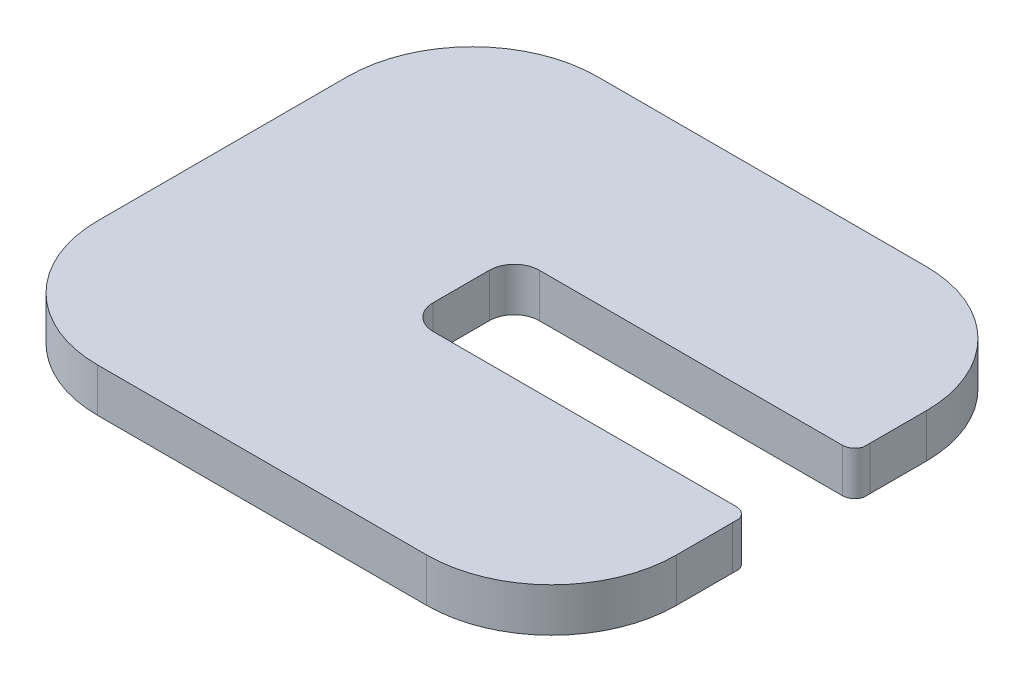
ISO-10303-21;
HEADER;
FILE_DESCRIPTION(('STEP AP214'),'2;1');
FILE_NAME('part.step','',(''),(''),'','','');
FILE_SCHEMA(('AUTOMOTIVE_DESIGN { 1 0 10303 214 1 1 1 1 }'));
ENDSEC;
DATA;
#1=APPLICATION_CONTEXT('core data for automotive mechanical design processes');
#2=APPLICATION_PROTOCOL_DEFINITION('international standard','automotive_design',2000,#1);
#3=PRODUCT_CONTEXT('',#1,'mechanical');
#4=PRODUCT('Part','Part','',(#3));
#5=PRODUCT_RELATED_PRODUCT_CATEGORY('part','',(#4));
#6=PRODUCT_DEFINITION_FORMATION('','',#4);
#7=PRODUCT_DEFINITION_CONTEXT('part definition',#1,'design');
#8=PRODUCT_DEFINITION('design','',#6,#7);
#9=PRODUCT_DEFINITION_SHAPE('','',#8);
#10=(LENGTH_UNIT() NAMED_UNIT(*) SI_UNIT(.MILLI.,.METRE.));
#11=(NAMED_UNIT(*) PLANE_ANGLE_UNIT() SI_UNIT($,.RADIAN.));
#12=(NAMED_UNIT(*) SI_UNIT($,.STERADIAN.) SOLID_ANGLE_UNIT());
#13=UNCERTAINTY_MEASURE_WITH_UNIT(LENGTH_MEASURE(1.E-05),#10,'distance_accuracy_value','');
#14=(GEOMETRIC_REPRESENTATION_CONTEXT(3) GLOBAL_UNCERTAINTY_ASSIGNED_CONTEXT((#13)) GLOBAL_UNIT_ASSIGNED_CONTEXT((#10,
#11,#12)) REPRESENTATION_CONTEXT('',''));
#15=CARTESIAN_POINT('',(0.,0.,0.));
#16=DIRECTION('',(0.,0.,1.));
#17=DIRECTION('',(1.,0.,0.));
#18=AXIS2_PLACEMENT_3D('',#15,#16,#17);
#19=CARTESIAN_POINT('',(-1.41064064605512,0.35,0.));
#20=DIRECTION('',(0.,1.,0.));
#21=DIRECTION('',(0.,0.,1.));
#22=AXIS2_PLACEMENT_3D('',#19,#20,#21);
#23=PLANE('',#22);
#24=CARTESIAN_POINT('',(-0.910640646055121,0.35,-1.));
#25=DIRECTION('',(0.,1.,0.));
#26=DIRECTION('',(0.,0.,1.));
#27=AXIS2_PLACEMENT_3D('',#24,#25,#26);
#28=CIRCLE('',#27,1.);
#29=CARTESIAN_POINT('',(-0.910640646055121,0.35,-2.));
#30=VERTEX_POINT('',#29);
#31=CARTESIAN_POINT('',(-1.91064064605512,0.35,-1.));
#32=VERTEX_POINT('',#31);
#33=EDGE_CURVE('E198',#30,#32,#28,.T.);
#34=ORIENTED_EDGE('',*,*,#33,.T.);
#35=DIRECTION('',(0.,0.,1.));
#36=VECTOR('',#35,1.);
#37=CARTESIAN_POINT('',(-1.91064064605512,0.35,-1.));
#38=LINE('',#37,#36);
#39=CARTESIAN_POINT('',(-1.91064064605512,0.35,1.));
#40=VERTEX_POINT('',#39);
#41=EDGE_CURVE('E206',#32,#40,#38,.T.);
#42=ORIENTED_EDGE('',*,*,#41,.T.);
#43=CARTESIAN_POINT('',(-0.910640646055121,0.35,1.));
#44=DIRECTION('',(0.,1.,0.));
#45=DIRECTION('',(0.,0.,-1.));
#46=AXIS2_PLACEMENT_3D('',#43,#44,#45);
#47=CIRCLE('',#46,1.);
#48=CARTESIAN_POINT('',(-0.910640646055121,0.35,2.));
#49=VERTEX_POINT('',#48);
#50=EDGE_CURVE('E209',#40,#49,#47,.T.);
#51=ORIENTED_EDGE('',*,*,#50,.T.);
#52=DIRECTION('',(1.,0.,0.));
#53=VECTOR('',#52,1.);
#54=CARTESIAN_POINT('',(1.72338750187201,0.35,2.));
#55=LINE('',#54,#53);
#56=CARTESIAN_POINT('',(1.72338750187201,0.35,2.));
#57=VERTEX_POINT('',#56);
#58=EDGE_CURVE('E213',#49,#57,#55,.T.);
#59=ORIENTED_EDGE('',*,*,#58,.T.);
#60=CARTESIAN_POINT('',(1.72338750187201,0.35,1.));
#61=DIRECTION('',(0.,1.,0.));
#62=DIRECTION('',(0.,0.,1.));
#63=AXIS2_PLACEMENT_3D('',#60,#61,#62);
#64=CIRCLE('',#63,1.);
#65=CARTESIAN_POINT('',(2.72338750187201,0.35,1.));
#66=VERTEX_POINT('',#65);
#67=EDGE_CURVE('E217',#57,#66,#64,.T.);
#68=ORIENTED_EDGE('',*,*,#67,.T.);
#69=DIRECTION('',(0.,0.,-1.));
#70=VECTOR('',#69,1.);
#71=CARTESIAN_POINT('',(2.72338750187201,0.35,0.499118095489748));
#72=LINE('',#71,#70);
#73=CARTESIAN_POINT('',(2.72338750187201,0.35,0.550881904510252));
#74=VERTEX_POINT('',#73);
#75=EDGE_CURVE('E189',#66,#74,#72,.T.);
#76=ORIENTED_EDGE('',*,*,#75,.T.);
#77=CARTESIAN_POINT('',(2.72338750187201,0.35,0.550881904510252));
#78=DIRECTION('',(0.,0.,-1.));
#79=VECTOR('',#78,1.);
#80=LINE('',#77,#79);
#81=CARTESIAN_POINT('',(2.72338750187201,0.35,0.499118095489748));
#82=VERTEX_POINT('',#81);
#83=EDGE_CURVE('E11',#74,#82,#80,.T.);
#84=ORIENTED_EDGE('',*,*,#83,.T.);
#85=CARTESIAN_POINT('',(2.62679491924311,0.35,0.525));
#86=DIRECTION('',(0.,1.,0.));
#87=DIRECTION('',(0.,0.,1.));
#88=AXIS2_PLACEMENT_3D('',#85,#86,#87);
#89=CIRCLE('',#88,0.1);
#90=CARTESIAN_POINT('',(2.62679491924311,0.35,0.425));
#91=VERTEX_POINT('',#90);
#92=EDGE_CURVE('E293',#82,#91,#89,.T.);
#93=ORIENTED_EDGE('',*,*,#92,.T.);
#94=DIRECTION('',(-1.,0.,0.));
#95=VECTOR('',#94,1.);
#96=CARTESIAN_POINT('',(0.2,0.35,0.425));
#97=LINE('',#96,#95);
#98=CARTESIAN_POINT('',(0.2,0.35,0.425));
#99=VERTEX_POINT('',#98);
#100=EDGE_CURVE('E365',#91,#99,#97,.T.);
#101=ORIENTED_EDGE('',*,*,#100,.T.);
#102=CARTESIAN_POINT('',(0.2,0.35,0.225));
#103=DIRECTION('',(0.,-1.,0.));
#104=DIRECTION('',(0.,0.,1.));
#105=AXIS2_PLACEMENT_3D('',#102,#103,#104);
#106=CIRCLE('',#105,0.2);
#107=CARTESIAN_POINT('',(0.,0.35,0.225));
#108=VERTEX_POINT('',#107);
#109=EDGE_CURVE('E368',#99,#108,#106,.T.);
#110=ORIENTED_EDGE('',*,*,#109,.T.);
#111=DIRECTION('',(0.,0.,-1.));
#112=VECTOR('',#111,1.);
#113=CARTESIAN_POINT('',(0.,0.35,-0.225));
#114=LINE('',#113,#112);
#115=CARTESIAN_POINT('',(0.,0.35,-0.225));
#116=VERTEX_POINT('',#115);
#117=EDGE_CURVE('E372',#108,#116,#114,.T.);
#118=ORIENTED_EDGE('',*,*,#117,.T.);
#119=CARTESIAN_POINT('',(0.2,0.35,-0.225));
#120=DIRECTION('',(0.,-1.,0.));
#121=DIRECTION('',(0.,0.,-1.));
#122=AXIS2_PLACEMENT_3D('',#119,#120,#121);
#123=CIRCLE('',#122,0.2);
#124=CARTESIAN_POINT('',(0.2,0.35,-0.425));
#125=VERTEX_POINT('',#124);
#126=EDGE_CURVE('E375',#116,#125,#123,.T.);
#127=ORIENTED_EDGE('',*,*,#126,.T.);
#128=DIRECTION('',(1.,0.,0.));
#129=VECTOR('',#128,1.);
#130=CARTESIAN_POINT('',(0.2,0.35,-0.425));
#131=LINE('',#130,#129);
#132=CARTESIAN_POINT('',(2.62679491924311,0.35,-0.425));
#133=VERTEX_POINT('',#132);
#134=EDGE_CURVE('E378',#125,#133,#131,.T.);
#135=ORIENTED_EDGE('',*,*,#134,.T.);
#136=CARTESIAN_POINT('',(2.62679491924311,0.35,-0.525));
#137=DIRECTION('',(0.,1.,0.));
#138=DIRECTION('',(0.,0.,1.));
#139=AXIS2_PLACEMENT_3D('',#136,#137,#138);
#140=CIRCLE('',#139,0.1);
#141=CARTESIAN_POINT('',(2.72338750187201,0.35,-0.499118095489748));
#142=VERTEX_POINT('',#141);
#143=EDGE_CURVE('E313',#133,#142,#140,.T.);
#144=ORIENTED_EDGE('',*,*,#143,.T.);
#145=CARTESIAN_POINT('',(2.72338750187201,0.35,-0.499118095489748));
#146=DIRECTION('',(0.,0.,-1.));
#147=VECTOR('',#146,1.);
#148=LINE('',#145,#147);
#149=CARTESIAN_POINT('',(2.72338750187201,0.35,-0.550881904510252));
#150=VERTEX_POINT('',#149);
#151=EDGE_CURVE('E51',#142,#150,#148,.T.);
#152=ORIENTED_EDGE('',*,*,#151,.T.);
#153=DIRECTION('',(0.,0.,-1.));
#154=VECTOR('',#153,1.);
#155=CARTESIAN_POINT('',(2.72338750187201,0.35,-0.499118095489748));
#156=LINE('',#155,#154);
#157=CARTESIAN_POINT('',(2.72338750187201,0.35,-1.));
#158=VERTEX_POINT('',#157);
#159=EDGE_CURVE('E170',#150,#158,#156,.T.);
#160=ORIENTED_EDGE('',*,*,#159,.T.);
#161=CARTESIAN_POINT('',(1.72338750187201,0.35,-1.));
#162=DIRECTION('',(0.,1.,0.));
#163=DIRECTION('',(0.,0.,1.));
#164=AXIS2_PLACEMENT_3D('',#161,#162,#163);
#165=CIRCLE('',#164,1.);
#166=CARTESIAN_POINT('',(1.72338750187201,0.35,-2.));
#167=VERTEX_POINT('',#166);
#168=EDGE_CURVE('E175',#158,#167,#165,.T.);
#169=ORIENTED_EDGE('',*,*,#168,.T.);
#170=DIRECTION('',(-1.,0.,0.));
#171=VECTOR('',#170,1.);
#172=CARTESIAN_POINT('',(1.72338750187201,0.35,-2.));
#173=LINE('',#172,#171);
#174=EDGE_CURVE('E195',#167,#30,#173,.T.);
#175=ORIENTED_EDGE('',*,*,#174,.T.);
#176=EDGE_LOOP('',(#34,#42,#51,#59,#68,#76,#84,#93,#101,#110,#118,#127,#135,#144,#152,#160,#169,#175));
#177=FACE_BOUND('',#176,.T.);
#178=ADVANCED_FACE('F39',(#177),#23,.T.);
#179=CARTESIAN_POINT('',(-1.41064064605512,0.,0.));
#180=DIRECTION('',(0.,1.,0.));
#181=DIRECTION('',(0.,0.,1.));
#182=AXIS2_PLACEMENT_3D('',#179,#180,#181);
#183=PLANE('',#182);
#184=DIRECTION('',(0.,0.,-1.));
#185=VECTOR('',#184,1.);
#186=CARTESIAN_POINT('',(-1.91064064605512,0.,-1.));
#187=LINE('',#186,#185);
#188=CARTESIAN_POINT('',(-1.91064064605512,0.,1.));
#189=VERTEX_POINT('',#188);
#190=CARTESIAN_POINT('',(-1.91064064605512,0.,-1.));
#191=VERTEX_POINT('',#190);
#192=EDGE_CURVE('E616',#189,#191,#187,.T.);
#193=ORIENTED_EDGE('',*,*,#192,.T.);
#194=CARTESIAN_POINT('',(-0.910640646055121,0.,-1.));
#195=DIRECTION('',(0.,1.,0.));
#196=DIRECTION('',(0.,0.,1.));
#197=AXIS2_PLACEMENT_3D('',#194,#195,#196);
#198=CIRCLE('',#197,1.);
#199=CARTESIAN_POINT('',(-0.910640646055121,0.,-2.));
#200=VERTEX_POINT('',#199);
#201=EDGE_CURVE('E609',#191,#200,#198,.F.);
#202=ORIENTED_EDGE('',*,*,#201,.T.);
#203=DIRECTION('',(1.,0.,0.));
#204=VECTOR('',#203,1.);
#205=CARTESIAN_POINT('',(1.72338750187201,0.,-2.));
#206=LINE('',#205,#204);
#207=CARTESIAN_POINT('',(1.72338750187201,0.,-2.));
#208=VERTEX_POINT('',#207);
#209=EDGE_CURVE('E605',#200,#208,#206,.T.);
#210=ORIENTED_EDGE('',*,*,#209,.T.);
#211=CARTESIAN_POINT('',(1.72338750187201,0.,-1.));
#212=DIRECTION('',(0.,1.,0.));
#213=DIRECTION('',(0.,0.,1.));
#214=AXIS2_PLACEMENT_3D('',#211,#212,#213);
#215=CIRCLE('',#214,1.);
#216=CARTESIAN_POINT('',(2.72338750187201,0.,-1.));
#217=VERTEX_POINT('',#216);
#218=EDGE_CURVE('E224',#208,#217,#215,.F.);
#219=ORIENTED_EDGE('',*,*,#218,.T.);
#220=DIRECTION('',(0.,0.,1.));
#221=VECTOR('',#220,1.);
#222=CARTESIAN_POINT('',(2.72338750187201,0.,-0.499118095489748));
#223=LINE('',#222,#221);
#224=CARTESIAN_POINT('',(2.72338750187201,0.,-0.550881904510252));
#225=VERTEX_POINT('',#224);
#226=EDGE_CURVE('E184',#217,#225,#223,.T.);
#227=ORIENTED_EDGE('',*,*,#226,.T.);
#228=CARTESIAN_POINT('',(2.72338750187201,0.,-0.550881904510252));
#229=DIRECTION('',(0.,0.,1.));
#230=VECTOR('',#229,1.);
#231=LINE('',#228,#230);
#232=CARTESIAN_POINT('',(2.72338750187201,0.,-0.499118095489748));
#233=VERTEX_POINT('',#232);
#234=EDGE_CURVE('E58',#225,#233,#231,.T.);
#235=ORIENTED_EDGE('',*,*,#234,.T.);
#236=CARTESIAN_POINT('',(2.62679491924311,0.,-0.525));
#237=DIRECTION('',(0.,1.,0.));
#238=DIRECTION('',(0.,0.,1.));
#239=AXIS2_PLACEMENT_3D('',#236,#237,#238);
#240=CIRCLE('',#239,0.1);
#241=CARTESIAN_POINT('',(2.62679491924311,0.,-0.425));
#242=VERTEX_POINT('',#241);
#243=EDGE_CURVE('E253',#233,#242,#240,.F.);
#244=ORIENTED_EDGE('',*,*,#243,.T.);
#245=DIRECTION('',(1.,0.,0.));
#246=VECTOR('',#245,1.);
#247=CARTESIAN_POINT('',(0.2,0.,-0.425));
#248=LINE('',#247,#246);
#249=CARTESIAN_POINT('',(0.2,0.,-0.425));
#250=VERTEX_POINT('',#249);
#251=EDGE_CURVE('E369',#250,#242,#248,.T.);
#252=ORIENTED_EDGE('',*,*,#251,.F.);
#253=CARTESIAN_POINT('',(0.2,0.,-0.225));
#254=DIRECTION('',(0.,-1.,0.));
#255=DIRECTION('',(0.,0.,-1.));
#256=AXIS2_PLACEMENT_3D('',#253,#254,#255);
#257=CIRCLE('',#256,0.2);
#258=CARTESIAN_POINT('',(0.,0.,-0.225));
#259=VERTEX_POINT('',#258);
#260=EDGE_CURVE('E392',#259,#250,#257,.T.);
#261=ORIENTED_EDGE('',*,*,#260,.F.);
#262=DIRECTION('',(0.,0.,-1.));
#263=VECTOR('',#262,1.);
#264=CARTESIAN_POINT('',(0.,0.,-0.225));
#265=LINE('',#264,#263);
#266=CARTESIAN_POINT('',(0.,0.,0.225));
#267=VERTEX_POINT('',#266);
#268=EDGE_CURVE('E389',#267,#259,#265,.T.);
#269=ORIENTED_EDGE('',*,*,#268,.F.);
#270=CARTESIAN_POINT('',(0.2,0.,0.225));
#271=DIRECTION('',(0.,-1.,0.));
#272=DIRECTION('',(0.,0.,1.));
#273=AXIS2_PLACEMENT_3D('',#270,#271,#272);
#274=CIRCLE('',#273,0.2);
#275=CARTESIAN_POINT('',(0.2,0.,0.425));
#276=VERTEX_POINT('',#275);
#277=EDGE_CURVE('E386',#276,#267,#274,.T.);
#278=ORIENTED_EDGE('',*,*,#277,.F.);
#279=DIRECTION('',(-1.,0.,0.));
#280=VECTOR('',#279,1.);
#281=CARTESIAN_POINT('',(0.2,0.,0.425));
#282=LINE('',#281,#280);
#283=CARTESIAN_POINT('',(2.62679491924311,0.,0.425));
#284=VERTEX_POINT('',#283);
#285=EDGE_CURVE('E383',#284,#276,#282,.T.);
#286=ORIENTED_EDGE('',*,*,#285,.F.);
#287=CARTESIAN_POINT('',(2.62679491924311,0.,0.525));
#288=DIRECTION('',(0.,1.,0.));
#289=DIRECTION('',(0.,0.,1.));
#290=AXIS2_PLACEMENT_3D('',#287,#288,#289);
#291=CIRCLE('',#290,0.1);
#292=CARTESIAN_POINT('',(2.72338750187201,0.,0.499118095489748));
#293=VERTEX_POINT('',#292);
#294=EDGE_CURVE('E348',#284,#293,#291,.F.);
#295=ORIENTED_EDGE('',*,*,#294,.T.);
#296=CARTESIAN_POINT('',(2.72338750187201,0.,0.499118095489748));
#297=DIRECTION('',(0.,0.,1.));
#298=VECTOR('',#297,1.);
#299=LINE('',#296,#298);
#300=CARTESIAN_POINT('',(2.72338750187201,0.,0.550881904510252));
#301=VERTEX_POINT('',#300);
#302=EDGE_CURVE('E424',#293,#301,#299,.T.);
#303=ORIENTED_EDGE('',*,*,#302,.T.);
#304=DIRECTION('',(0.,0.,1.));
#305=VECTOR('',#304,1.);
#306=CARTESIAN_POINT('',(2.72338750187201,0.,0.499118095489748));
#307=LINE('',#306,#305);
#308=CARTESIAN_POINT('',(2.72338750187201,0.,1.));
#309=VERTEX_POINT('',#308);
#310=EDGE_CURVE('E354',#301,#309,#307,.T.);
#311=ORIENTED_EDGE('',*,*,#310,.T.);
#312=CARTESIAN_POINT('',(1.72338750187201,0.,1.));
#313=DIRECTION('',(0.,1.,0.));
#314=DIRECTION('',(0.,0.,1.));
#315=AXIS2_PLACEMENT_3D('',#312,#313,#314);
#316=CIRCLE('',#315,1.);
#317=CARTESIAN_POINT('',(1.72338750187201,0.,2.));
#318=VERTEX_POINT('',#317);
#319=EDGE_CURVE('E201',#309,#318,#316,.F.);
#320=ORIENTED_EDGE('',*,*,#319,.T.);
#321=DIRECTION('',(-1.,0.,0.));
#322=VECTOR('',#321,1.);
#323=CARTESIAN_POINT('',(1.72338750187201,0.,2.));
#324=LINE('',#323,#322);
#325=CARTESIAN_POINT('',(-0.910640646055121,0.,2.));
#326=VERTEX_POINT('',#325);
#327=EDGE_CURVE('E626',#318,#326,#324,.T.);
#328=ORIENTED_EDGE('',*,*,#327,.T.);
#329=CARTESIAN_POINT('',(-0.910640646055121,0.,1.));
#330=DIRECTION('',(0.,1.,0.));
#331=DIRECTION('',(0.,0.,1.));
#332=AXIS2_PLACEMENT_3D('',#329,#330,#331);
#333=CIRCLE('',#332,1.);
#334=EDGE_CURVE('E620',#326,#189,#333,.F.);
#335=ORIENTED_EDGE('',*,*,#334,.T.);
#336=EDGE_LOOP('',(#193,#202,#210,#219,#227,#235,#244,#252,#261,#269,#278,#286,#295,#303,#311,
#320,#328,#335));
#337=FACE_BOUND('',#336,.T.);
#338=ADVANCED_FACE('F304',(#337),#183,.F.);
#339=CARTESIAN_POINT('',(0.2,0.35,0.425));
#340=DIRECTION('',(0.,0.,1.));
#341=DIRECTION('',(1.,0.,0.));
#342=AXIS2_PLACEMENT_3D('',#339,#340,#341);
#343=PLANE('',#342);
#344=ORIENTED_EDGE('',*,*,#100,.F.);
#345=DIRECTION('',(0.,-1.,0.));
#346=VECTOR('',#345,1.);
#347=CARTESIAN_POINT('',(2.62679491924311,0.35,0.425));
#348=LINE('',#347,#346);
#349=EDGE_CURVE('E321',#91,#284,#348,.T.);
#350=ORIENTED_EDGE('',*,*,#349,.T.);
#351=ORIENTED_EDGE('',*,*,#285,.T.);
#352=DIRECTION('',(0.,-1.,0.));
#353=VECTOR('',#352,1.);
#354=CARTESIAN_POINT('',(0.2,0.35,0.425));
#355=LINE('',#354,#353);
#356=EDGE_CURVE('E409',#99,#276,#355,.T.);
#357=ORIENTED_EDGE('',*,*,#356,.F.);
#358=EDGE_LOOP('',(#344,#350,#351,#357));
#359=FACE_BOUND('',#358,.T.);
#360=ADVANCED_FACE('F272',(#359),#343,.F.);
#361=CARTESIAN_POINT('',(0.2,0.35,0.225));
#362=DIRECTION('',(0.,-1.,0.));
#363=DIRECTION('',(0.,0.,-1.));
#364=AXIS2_PLACEMENT_3D('',#361,#362,#363);
#365=CYLINDRICAL_SURFACE('',#364,0.2);
#366=ORIENTED_EDGE('',*,*,#277,.T.);
#367=DIRECTION('',(0.,-1.,0.));
#368=VECTOR('',#367,1.);
#369=CARTESIAN_POINT('',(0.,0.35,0.225));
#370=LINE('',#369,#368);
#371=EDGE_CURVE('E405',#108,#267,#370,.T.);
#372=ORIENTED_EDGE('',*,*,#371,.F.);
#373=ORIENTED_EDGE('',*,*,#109,.F.);
#374=ORIENTED_EDGE('',*,*,#356,.T.);
#375=EDGE_LOOP('',(#366,#372,#373,#374));
#376=FACE_BOUND('',#375,.T.);
#377=ADVANCED_FACE('F441',(#376),#365,.F.);
#378=CARTESIAN_POINT('',(0.,0.35,-0.225));
#379=DIRECTION('',(-1.,0.,0.));
#380=DIRECTION('',(0.,0.,1.));
#381=AXIS2_PLACEMENT_3D('',#378,#379,#380);
#382=PLANE('',#381);
#383=ORIENTED_EDGE('',*,*,#268,.T.);
#384=DIRECTION('',(0.,-1.,0.));
#385=VECTOR('',#384,1.);
#386=CARTESIAN_POINT('',(0.,0.35,-0.225));
#387=LINE('',#386,#385);
#388=EDGE_CURVE('E401',#116,#259,#387,.T.);
#389=ORIENTED_EDGE('',*,*,#388,.F.);
#390=ORIENTED_EDGE('',*,*,#117,.F.);
#391=ORIENTED_EDGE('',*,*,#371,.T.);
#392=EDGE_LOOP('',(#383,#389,#390,#391));
#393=FACE_BOUND('',#392,.T.);
#394=ADVANCED_FACE('F447',(#393),#382,.F.);
#395=CARTESIAN_POINT('',(0.2,0.35,-0.225));
#396=DIRECTION('',(0.,-1.,0.));
#397=DIRECTION('',(0.,0.,-1.));
#398=AXIS2_PLACEMENT_3D('',#395,#396,#397);
#399=CYLINDRICAL_SURFACE('',#398,0.2);
#400=ORIENTED_EDGE('',*,*,#260,.T.);
#401=DIRECTION('',(0.,-1.,0.));
#402=VECTOR('',#401,1.);
#403=CARTESIAN_POINT('',(0.2,0.35,-0.425));
#404=LINE('',#403,#402);
#405=EDGE_CURVE('E382',#125,#250,#404,.T.);
#406=ORIENTED_EDGE('',*,*,#405,.F.);
#407=ORIENTED_EDGE('',*,*,#126,.F.);
#408=ORIENTED_EDGE('',*,*,#388,.T.);
#409=EDGE_LOOP('',(#400,#406,#407,#408));
#410=FACE_BOUND('',#409,.T.);
#411=ADVANCED_FACE('F451',(#410),#399,.F.);
#412=CARTESIAN_POINT('',(0.2,0.35,-0.425));
#413=DIRECTION('',(0.,0.,-1.));
#414=DIRECTION('',(-1.,0.,0.));
#415=AXIS2_PLACEMENT_3D('',#412,#413,#414);
#416=PLANE('',#415);
#417=ORIENTED_EDGE('',*,*,#251,.T.);
#418=DIRECTION('',(0.,-1.,0.));
#419=VECTOR('',#418,1.);
#420=CARTESIAN_POINT('',(2.62679491924311,0.35,-0.425));
#421=LINE('',#420,#419);
#422=EDGE_CURVE('E414',#242,#133,#421,.F.);
#423=ORIENTED_EDGE('',*,*,#422,.T.);
#424=ORIENTED_EDGE('',*,*,#134,.F.);
#425=ORIENTED_EDGE('',*,*,#405,.T.);
#426=EDGE_LOOP('',(#417,#423,#424,#425));
#427=FACE_BOUND('',#426,.T.);
#428=ADVANCED_FACE('F271',(#427),#416,.F.);
#429=CARTESIAN_POINT('',(2.62679491924311,0.35,-0.525));
#430=DIRECTION('',(0.,-1.,0.));
#431=DIRECTION('',(0.,0.,-1.));
#432=AXIS2_PLACEMENT_3D('',#429,#430,#431);
#433=CYLINDRICAL_SURFACE('',#432,0.1);
#434=ORIENTED_EDGE('',*,*,#151,.F.);
#435=ORIENTED_EDGE('',*,*,#143,.F.);
#436=ORIENTED_EDGE('',*,*,#422,.F.);
#437=ORIENTED_EDGE('',*,*,#243,.F.);
#438=ORIENTED_EDGE('',*,*,#234,.F.);
#439=DIRECTION('',(0.,-1.,0.));
#440=VECTOR('',#439,1.);
#441=CARTESIAN_POINT('',(2.72338750187201,0.35,-0.550881904510252));
#442=LINE('',#441,#440);
#443=EDGE_CURVE('E248',#150,#225,#442,.T.);
#444=ORIENTED_EDGE('',*,*,#443,.F.);
#445=EDGE_LOOP('',(#434,#435,#436,#437,#438,#444));
#446=FACE_BOUND('',#445,.T.);
#447=ADVANCED_FACE('F262',(#446),#433,.T.);
#448=CARTESIAN_POINT('',(2.62679491924311,0.35,0.525));
#449=DIRECTION('',(0.,-1.,0.));
#450=DIRECTION('',(0.,0.,-1.));
#451=AXIS2_PLACEMENT_3D('',#448,#449,#450);
#452=CYLINDRICAL_SURFACE('',#451,0.1);
#453=DIRECTION('',(0.,-1.,0.));
#454=VECTOR('',#453,1.);
#455=CARTESIAN_POINT('',(2.72338750187201,0.35,0.550881904510252));
#456=LINE('',#455,#454);
#457=EDGE_CURVE('E252',#301,#74,#456,.F.);
#458=ORIENTED_EDGE('',*,*,#457,.F.);
#459=ORIENTED_EDGE('',*,*,#302,.F.);
#460=ORIENTED_EDGE('',*,*,#294,.F.);
#461=ORIENTED_EDGE('',*,*,#349,.F.);
#462=ORIENTED_EDGE('',*,*,#92,.F.);
#463=ORIENTED_EDGE('',*,*,#83,.F.);
#464=EDGE_LOOP('',(#458,#459,#460,#461,#462,#463));
#465=FACE_BOUND('',#464,.T.);
#466=ADVANCED_FACE('F41',(#465),#452,.T.);
#467=CARTESIAN_POINT('',(-1.91064064605512,-6.12161881170177,-1.));
#468=DIRECTION('',(-1.,0.,0.));
#469=DIRECTION('',(0.,0.,1.));
#470=AXIS2_PLACEMENT_3D('',#467,#468,#469);
#471=PLANE('',#470);
#472=DIRECTION('',(0.,1.,0.));
#473=VECTOR('',#472,1.);
#474=CARTESIAN_POINT('',(-1.91064064605512,-6.12161881170177,-1.));
#475=LINE('',#474,#473);
#476=EDGE_CURVE('E235',#191,#32,#475,.T.);
#477=ORIENTED_EDGE('',*,*,#476,.F.);
#478=ORIENTED_EDGE('',*,*,#192,.F.);
#479=DIRECTION('',(0.,1.,0.));
#480=VECTOR('',#479,1.);
#481=CARTESIAN_POINT('',(-1.91064064605512,-6.12161881170177,1.));
#482=LINE('',#481,#480);
#483=EDGE_CURVE('E231',#189,#40,#482,.T.);
#484=ORIENTED_EDGE('',*,*,#483,.T.);
#485=ORIENTED_EDGE('',*,*,#41,.F.);
#486=EDGE_LOOP('',(#477,#478,#484,#485));
#487=FACE_BOUND('',#486,.T.);
#488=ADVANCED_FACE('F512',(#487),#471,.T.);
#489=CARTESIAN_POINT('',(2.72338750187201,-6.12161881170177,0.499118095489748));
#490=DIRECTION('',(1.,0.,0.));
#491=DIRECTION('',(0.,0.,-1.));
#492=AXIS2_PLACEMENT_3D('',#489,#490,#491);
#493=PLANE('',#492);
#494=ORIENTED_EDGE('',*,*,#310,.F.);
#495=ORIENTED_EDGE('',*,*,#457,.T.);
#496=ORIENTED_EDGE('',*,*,#75,.F.);
#497=DIRECTION('',(0.,1.,0.));
#498=VECTOR('',#497,1.);
#499=CARTESIAN_POINT('',(2.72338750187201,-6.12161881170177,1.));
#500=LINE('',#499,#498);
#501=EDGE_CURVE('E221',#309,#66,#500,.T.);
#502=ORIENTED_EDGE('',*,*,#501,.F.);
#503=EDGE_LOOP('',(#494,#495,#496,#502));
#504=FACE_BOUND('',#503,.T.);
#505=ADVANCED_FACE('F526',(#504),#493,.T.);
#506=CARTESIAN_POINT('',(1.72338750187201,-6.12161881170177,1.));
#507=DIRECTION('',(0.,1.,0.));
#508=DIRECTION('',(0.,0.,1.));
#509=AXIS2_PLACEMENT_3D('',#506,#507,#508);
#510=CYLINDRICAL_SURFACE('',#509,1.);
#511=ORIENTED_EDGE('',*,*,#319,.F.);
#512=ORIENTED_EDGE('',*,*,#501,.T.);
#513=ORIENTED_EDGE('',*,*,#67,.F.);
#514=DIRECTION('',(0.,1.,0.));
#515=VECTOR('',#514,1.);
#516=CARTESIAN_POINT('',(1.72338750187201,-6.12161881170177,2.));
#517=LINE('',#516,#515);
#518=EDGE_CURVE('E225',#318,#57,#517,.T.);
#519=ORIENTED_EDGE('',*,*,#518,.F.);
#520=EDGE_LOOP('',(#511,#512,#513,#519));
#521=FACE_BOUND('',#520,.T.);
#522=ADVANCED_FACE('F535',(#521),#510,.T.);
#523=CARTESIAN_POINT('',(1.72338750187201,-6.12161881170177,2.));
#524=DIRECTION('',(0.,0.,1.));
#525=DIRECTION('',(1.,0.,0.));
#526=AXIS2_PLACEMENT_3D('',#523,#524,#525);
#527=PLANE('',#526);
#528=ORIENTED_EDGE('',*,*,#327,.F.);
#529=ORIENTED_EDGE('',*,*,#518,.T.);
#530=ORIENTED_EDGE('',*,*,#58,.F.);
#531=DIRECTION('',(0.,1.,0.));
#532=VECTOR('',#531,1.);
#533=CARTESIAN_POINT('',(-0.910640646055121,-6.12161881170177,2.));
#534=LINE('',#533,#532);
#535=EDGE_CURVE('E228',#326,#49,#534,.T.);
#536=ORIENTED_EDGE('',*,*,#535,.F.);
#537=EDGE_LOOP('',(#528,#529,#530,#536));
#538=FACE_BOUND('',#537,.T.);
#539=ADVANCED_FACE('F543',(#538),#527,.T.);
#540=CARTESIAN_POINT('',(-0.910640646055121,-6.12161881170177,1.));
#541=DIRECTION('',(0.,1.,0.));
#542=DIRECTION('',(0.,0.,1.));
#543=AXIS2_PLACEMENT_3D('',#540,#541,#542);
#544=CYLINDRICAL_SURFACE('',#543,1.);
#545=ORIENTED_EDGE('',*,*,#334,.F.);
#546=ORIENTED_EDGE('',*,*,#535,.T.);
#547=ORIENTED_EDGE('',*,*,#50,.F.);
#548=ORIENTED_EDGE('',*,*,#483,.F.);
#549=EDGE_LOOP('',(#545,#546,#547,#548));
#550=FACE_BOUND('',#549,.T.);
#551=ADVANCED_FACE('F552',(#550),#544,.T.);
#552=CARTESIAN_POINT('',(-0.910640646055121,-6.12161881170177,-1.));
#553=DIRECTION('',(0.,1.,0.));
#554=DIRECTION('',(0.,0.,1.));
#555=AXIS2_PLACEMENT_3D('',#552,#553,#554);
#556=CYLINDRICAL_SURFACE('',#555,1.);
#557=ORIENTED_EDGE('',*,*,#201,.F.);
#558=ORIENTED_EDGE('',*,*,#476,.T.);
#559=ORIENTED_EDGE('',*,*,#33,.F.);
#560=DIRECTION('',(0.,1.,0.));
#561=VECTOR('',#560,1.);
#562=CARTESIAN_POINT('',(-0.910640646055121,-6.12161881170177,-2.));
#563=LINE('',#562,#561);
#564=EDGE_CURVE('E239',#200,#30,#563,.T.);
#565=ORIENTED_EDGE('',*,*,#564,.F.);
#566=EDGE_LOOP('',(#557,#558,#559,#565));
#567=FACE_BOUND('',#566,.T.);
#568=ADVANCED_FACE('F561',(#567),#556,.T.);
#569=CARTESIAN_POINT('',(1.72338750187201,-6.12161881170177,-2.));
#570=DIRECTION('',(0.,0.,-1.));
#571=DIRECTION('',(-1.,0.,0.));
#572=AXIS2_PLACEMENT_3D('',#569,#570,#571);
#573=PLANE('',#572);
#574=ORIENTED_EDGE('',*,*,#209,.F.);
#575=ORIENTED_EDGE('',*,*,#564,.T.);
#576=ORIENTED_EDGE('',*,*,#174,.F.);
#577=DIRECTION('',(0.,1.,0.));
#578=VECTOR('',#577,1.);
#579=CARTESIAN_POINT('',(1.72338750187201,-6.12161881170177,-2.));
#580=LINE('',#579,#578);
#581=EDGE_CURVE('E188',#208,#167,#580,.T.);
#582=ORIENTED_EDGE('',*,*,#581,.F.);
#583=EDGE_LOOP('',(#574,#575,#576,#582));
#584=FACE_BOUND('',#583,.T.);
#585=ADVANCED_FACE('F570',(#584),#573,.T.);
#586=CARTESIAN_POINT('',(1.72338750187201,-6.12161881170177,-1.));
#587=DIRECTION('',(0.,1.,0.));
#588=DIRECTION('',(0.,0.,1.));
#589=AXIS2_PLACEMENT_3D('',#586,#587,#588);
#590=CYLINDRICAL_SURFACE('',#589,1.);
#591=ORIENTED_EDGE('',*,*,#218,.F.);
#592=ORIENTED_EDGE('',*,*,#581,.T.);
#593=ORIENTED_EDGE('',*,*,#168,.F.);
#594=DIRECTION('',(0.,1.,0.));
#595=VECTOR('',#594,1.);
#596=CARTESIAN_POINT('',(2.72338750187201,-6.12161881170177,-1.));
#597=LINE('',#596,#595);
#598=EDGE_CURVE('E182',#217,#158,#597,.T.);
#599=ORIENTED_EDGE('',*,*,#598,.F.);
#600=EDGE_LOOP('',(#591,#592,#593,#599));
#601=FACE_BOUND('',#600,.T.);
#602=ADVANCED_FACE('F191',(#601),#590,.T.);
#603=CARTESIAN_POINT('',(2.72338750187201,-6.12161881170177,-0.499118095489748));
#604=DIRECTION('',(1.,0.,0.));
#605=DIRECTION('',(0.,0.,-1.));
#606=AXIS2_PLACEMENT_3D('',#603,#604,#605);
#607=PLANE('',#606);
#608=ORIENTED_EDGE('',*,*,#159,.F.);
#609=ORIENTED_EDGE('',*,*,#443,.T.);
#610=ORIENTED_EDGE('',*,*,#226,.F.);
#611=ORIENTED_EDGE('',*,*,#598,.T.);
#612=EDGE_LOOP('',(#608,#609,#610,#611));
#613=FACE_BOUND('',#612,.T.);
#614=ADVANCED_FACE('F183',(#613),#607,.T.);
#615=CLOSED_SHELL('',(#178,#338,#360,#377,#394,#411,#428,#447,#466,#488,#505,#522,#539,#551,
#568,#585,#602,#614));
#616=MANIFOLD_SOLID_BREP('B2',#615);
#617=ADVANCED_BREP_SHAPE_REPRESENTATION('',(#18,#616),#14);
#618=SHAPE_DEFINITION_REPRESENTATION(#9,#617);
ENDSEC;
END-ISO-10303-21;
